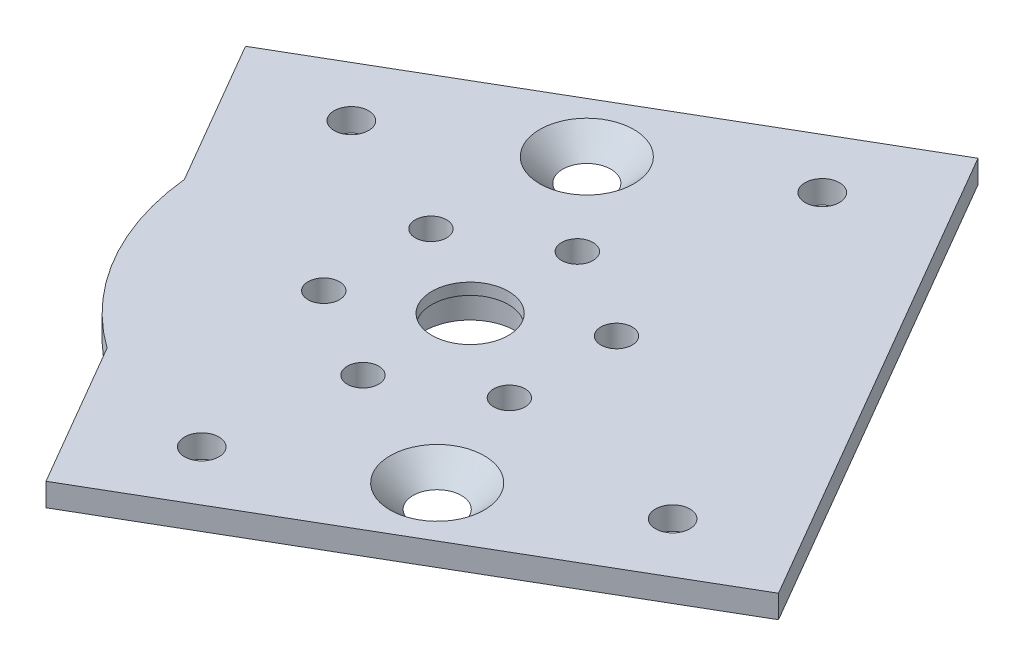
ISO-10303-21;
HEADER;
FILE_DESCRIPTION(('STEP AP214'),'2;1');
FILE_NAME('part.step','',(''),(''),'','','');
FILE_SCHEMA(('AUTOMOTIVE_DESIGN { 1 0 10303 214 1 1 1 1 }'));
ENDSEC;
DATA;
#1=APPLICATION_CONTEXT('core data for automotive mechanical design processes');
#2=APPLICATION_PROTOCOL_DEFINITION('international standard','automotive_design',2000,#1);
#3=PRODUCT_CONTEXT('',#1,'mechanical');
#4=PRODUCT('Part','Part','',(#3));
#5=PRODUCT_RELATED_PRODUCT_CATEGORY('part','',(#4));
#6=PRODUCT_DEFINITION_FORMATION('','',#4);
#7=PRODUCT_DEFINITION_CONTEXT('part definition',#1,'design');
#8=PRODUCT_DEFINITION('design','',#6,#7);
#9=PRODUCT_DEFINITION_SHAPE('','',#8);
#10=(LENGTH_UNIT() NAMED_UNIT(*) SI_UNIT(.MILLI.,.METRE.));
#11=(NAMED_UNIT(*) PLANE_ANGLE_UNIT() SI_UNIT($,.RADIAN.));
#12=(NAMED_UNIT(*) SI_UNIT($,.STERADIAN.) SOLID_ANGLE_UNIT());
#13=UNCERTAINTY_MEASURE_WITH_UNIT(LENGTH_MEASURE(1.E-05),#10,'distance_accuracy_value','');
#14=(GEOMETRIC_REPRESENTATION_CONTEXT(3) GLOBAL_UNCERTAINTY_ASSIGNED_CONTEXT((#13)) GLOBAL_UNIT_ASSIGNED_CONTEXT((#10,
#11,#12)) REPRESENTATION_CONTEXT('',''));
#15=CARTESIAN_POINT('',(0.,0.,0.));
#16=DIRECTION('',(0.,0.,1.));
#17=DIRECTION('',(1.,0.,0.));
#18=AXIS2_PLACEMENT_3D('',#15,#16,#17);
#19=CARTESIAN_POINT('',(0.,3.,0.));
#20=DIRECTION('',(0.,-1.,0.));
#21=DIRECTION('',(0.,0.,-1.));
#22=AXIS2_PLACEMENT_3D('',#19,#20,#21);
#23=CYLINDRICAL_SURFACE('',#22,34.);
#24=DIRECTION('',(0.,1.,0.));
#25=VECTOR('',#24,1.);
#26=CARTESIAN_POINT('',(-33.81860468845,0.,3.50741741547083));
#27=LINE('',#26,#25);
#28=CARTESIAN_POINT('',(-33.81860468845,0.,3.50741741547083));
#29=VERTEX_POINT('',#28);
#30=CARTESIAN_POINT('',(-33.81860468845,3.,3.50741741547083));
#31=VERTEX_POINT('',#30);
#32=EDGE_CURVE('E55',#29,#31,#27,.T.);
#33=ORIENTED_EDGE('',*,*,#32,.F.);
#34=CARTESIAN_POINT('',(0.,0.,0.));
#35=DIRECTION('',(0.,1.,0.));
#36=DIRECTION('',(0.,0.,1.));
#37=AXIS2_PLACEMENT_3D('',#34,#35,#36);
#38=CIRCLE('',#37,34.);
#39=CARTESIAN_POINT('',(-19.7823436250058,0.,27.6524660871719));
#40=VERTEX_POINT('',#39);
#41=EDGE_CURVE('E187',#29,#40,#38,.T.);
#42=ORIENTED_EDGE('',*,*,#41,.T.);
#43=DIRECTION('',(0.,1.,0.));
#44=VECTOR('',#43,1.);
#45=CARTESIAN_POINT('',(-19.7823436250058,0.,27.6524660871719));
#46=LINE('',#45,#44);
#47=CARTESIAN_POINT('',(-19.7823436250058,3.,27.6524660871719));
#48=VERTEX_POINT('',#47);
#49=EDGE_CURVE('E138',#40,#48,#46,.T.);
#50=ORIENTED_EDGE('',*,*,#49,.T.);
#51=CARTESIAN_POINT('',(0.,3.,0.));
#52=DIRECTION('',(0.,1.,0.));
#53=DIRECTION('',(0.,0.,1.));
#54=AXIS2_PLACEMENT_3D('',#51,#52,#53);
#55=CIRCLE('',#54,34.);
#56=EDGE_CURVE('E190',#31,#48,#55,.T.);
#57=ORIENTED_EDGE('',*,*,#56,.F.);
#58=EDGE_LOOP('',(#33,#42,#50,#57));
#59=FACE_BOUND('',#58,.T.);
#60=ADVANCED_FACE('F39',(#59),#23,.T.);
#61=CARTESIAN_POINT('',(0.,0.,0.));
#62=DIRECTION('',(0.,1.,0.));
#63=DIRECTION('',(0.,0.,1.));
#64=AXIS2_PLACEMENT_3D('',#61,#62,#63);
#65=PLANE('',#64);
#66=CARTESIAN_POINT('',(17.0277523842768,0.,21.3320333943987));
#67=DIRECTION('',(0.,1.,0.));
#68=DIRECTION('',(0.,0.,1.));
#69=AXIS2_PLACEMENT_3D('',#66,#67,#68);
#70=CIRCLE('',#69,3.15000000000008);
#71=CARTESIAN_POINT('',(17.0277523842768,0.,24.4820333943988));
#72=VERTEX_POINT('',#71);
#73=EDGE_CURVE('E11',#72,#72,#70,.T.);
#74=ORIENTED_EDGE('',*,*,#73,.T.);
#75=EDGE_LOOP('',(#74));
#76=FACE_BOUND('',#75,.T.);
#77=CARTESIAN_POINT('',(-10.1115009889926,0.,-25.3526635237722));
#78=DIRECTION('',(0.,1.,0.));
#79=DIRECTION('',(0.,0.,1.));
#80=AXIS2_PLACEMENT_3D('',#77,#78,#79);
#81=CIRCLE('',#80,3.15000000000003);
#82=CARTESIAN_POINT('',(-10.1115009889926,0.,-22.2026635237722));
#83=VERTEX_POINT('',#82);
#84=EDGE_CURVE('E48',#83,#83,#81,.T.);
#85=ORIENTED_EDGE('',*,*,#84,.T.);
#86=EDGE_LOOP('',(#85));
#87=FACE_BOUND('',#86,.T.);
#88=CARTESIAN_POINT('',(9.34045606024535,0.,-36.6606857626345));
#89=DIRECTION('',(0.,-1.,0.));
#90=DIRECTION('',(0.,0.,-1.));
#91=AXIS2_PLACEMENT_3D('',#88,#89,#90);
#92=CIRCLE('',#91,2.25);
#93=CARTESIAN_POINT('',(9.34045606024535,0.,-38.9106857626345));
#94=VERTEX_POINT('',#93);
#95=EDGE_CURVE('E539',#94,#94,#92,.T.);
#96=ORIENTED_EDGE('',*,*,#95,.F.);
#97=EDGE_LOOP('',(#96));
#98=FACE_BOUND('',#97,.T.);
#99=CARTESIAN_POINT('',(36.4797094335147,0.,10.0240111555365));
#100=DIRECTION('',(0.,-1.,0.));
#101=DIRECTION('',(0.,0.,-1.));
#102=AXIS2_PLACEMENT_3D('',#99,#100,#101);
#103=CIRCLE('',#102,2.25);
#104=CARTESIAN_POINT('',(36.4797094335147,0.,7.7740111555365));
#105=VERTEX_POINT('',#104);
#106=EDGE_CURVE('E535',#105,#105,#103,.T.);
#107=ORIENTED_EDGE('',*,*,#106,.F.);
#108=EDGE_LOOP('',(#107));
#109=FACE_BOUND('',#108,.T.);
#110=CARTESIAN_POINT('',(-29.5634580382305,0.,-14.04464128491));
#111=DIRECTION('',(0.,-1.,0.));
#112=DIRECTION('',(0.,0.,-1.));
#113=AXIS2_PLACEMENT_3D('',#110,#111,#112);
#114=CIRCLE('',#113,2.25);
#115=CARTESIAN_POINT('',(-29.5634580382305,0.,-16.29464128491));
#116=VERTEX_POINT('',#115);
#117=EDGE_CURVE('E531',#116,#116,#114,.T.);
#118=ORIENTED_EDGE('',*,*,#117,.F.);
#119=EDGE_LOOP('',(#118));
#120=FACE_BOUND('',#119,.T.);
#121=CARTESIAN_POINT('',(-2.42420466496118,0.,32.640055633261));
#122=DIRECTION('',(0.,-1.,0.));
#123=DIRECTION('',(0.,0.,-1.));
#124=AXIS2_PLACEMENT_3D('',#121,#122,#123);
#125=CIRCLE('',#124,2.25);
#126=CARTESIAN_POINT('',(-2.42420466496118,0.,30.390055633261));
#127=VERTEX_POINT('',#126);
#128=EDGE_CURVE('E540',#127,#127,#125,.T.);
#129=ORIENTED_EDGE('',*,*,#128,.F.);
#130=EDGE_LOOP('',(#129));
#131=FACE_BOUND('',#130,.T.);
#132=CARTESIAN_POINT('',(-12.1243556529822,0.,-6.99999999999905));
#133=DIRECTION('',(0.,1.,0.));
#134=DIRECTION('',(0.,0.,1.));
#135=AXIS2_PLACEMENT_3D('',#132,#133,#134);
#136=CIRCLE('',#135,2.05000000000121);
#137=CARTESIAN_POINT('',(-12.1243556529822,0.,-4.94999999999784));
#138=VERTEX_POINT('',#137);
#139=EDGE_CURVE('E157',#138,#138,#136,.T.);
#140=ORIENTED_EDGE('',*,*,#139,.T.);
#141=EDGE_LOOP('',(#140));
#142=FACE_BOUND('',#141,.T.);
#143=CARTESIAN_POINT('',(-12.1243556529807,0.,7.00000000000087));
#144=DIRECTION('',(0.,1.,0.));
#145=DIRECTION('',(0.,0.,1.));
#146=AXIS2_PLACEMENT_3D('',#143,#144,#145);
#147=CIRCLE('',#146,2.05000000000208);
#148=CARTESIAN_POINT('',(-12.1243556529807,0.,9.05000000000295));
#149=VERTEX_POINT('',#148);
#150=EDGE_CURVE('E156',#149,#149,#147,.T.);
#151=ORIENTED_EDGE('',*,*,#150,.T.);
#152=EDGE_LOOP('',(#151));
#153=FACE_BOUND('',#152,.T.);
#154=CARTESIAN_POINT('',(1.98437614357186E-12,0.,14.));
#155=DIRECTION('',(0.,1.,0.));
#156=DIRECTION('',(0.,0.,1.));
#157=AXIS2_PLACEMENT_3D('',#154,#155,#156);
#158=CIRCLE('',#157,2.05000000000225);
#159=CARTESIAN_POINT('',(1.98437614357186E-12,0.,16.0500000000022));
#160=VERTEX_POINT('',#159);
#161=EDGE_CURVE('E163',#160,#160,#158,.T.);
#162=ORIENTED_EDGE('',*,*,#161,.T.);
#163=EDGE_LOOP('',(#162));
#164=FACE_BOUND('',#163,.T.);
#165=CARTESIAN_POINT('',(12.1243556529836,0.,6.99999999999914));
#166=DIRECTION('',(0.,1.,0.));
#167=DIRECTION('',(0.,0.,1.));
#168=AXIS2_PLACEMENT_3D('',#165,#166,#167);
#169=CIRCLE('',#168,2.05000000000147);
#170=CARTESIAN_POINT('',(12.1243556529836,0.,9.05000000000061));
#171=VERTEX_POINT('',#170);
#172=EDGE_CURVE('E169',#171,#171,#169,.T.);
#173=ORIENTED_EDGE('',*,*,#172,.T.);
#174=EDGE_LOOP('',(#173));
#175=FACE_BOUND('',#174,.T.);
#176=CARTESIAN_POINT('',(12.1243556529826,0.,-7.00000000000086));
#177=DIRECTION('',(0.,1.,0.));
#178=DIRECTION('',(0.,0.,1.));
#179=AXIS2_PLACEMENT_3D('',#176,#177,#178);
#180=CIRCLE('',#179,2.05000000000028);
#181=CARTESIAN_POINT('',(12.1243556529826,0.,-4.95000000000058));
#182=VERTEX_POINT('',#181);
#183=EDGE_CURVE('E175',#182,#182,#180,.T.);
#184=ORIENTED_EDGE('',*,*,#183,.T.);
#185=EDGE_LOOP('',(#184));
#186=FACE_BOUND('',#185,.T.);
#187=CARTESIAN_POINT('',(0.,0.,-14.));
#188=DIRECTION('',(0.,1.,0.));
#189=DIRECTION('',(0.,0.,1.));
#190=AXIS2_PLACEMENT_3D('',#187,#188,#189);
#191=CIRCLE('',#190,2.05);
#192=CARTESIAN_POINT('',(0.,0.,-11.95));
#193=VERTEX_POINT('',#192);
#194=EDGE_CURVE('E181',#193,#193,#191,.T.);
#195=ORIENTED_EDGE('',*,*,#194,.T.);
#196=EDGE_LOOP('',(#195));
#197=FACE_BOUND('',#196,.T.);
#198=ORIENTED_EDGE('',*,*,#41,.F.);
#199=DIRECTION('',(-0.502578766171655,0.,-0.864531424410575));
#200=VECTOR('',#199,1.);
#201=CARTESIAN_POINT('',(-26.8004741567279,0.,15.5799417513214));
#202=LINE('',#201,#200);
#203=CARTESIAN_POINT('',(-44.8933097389076,0.,-15.5431895274595));
#204=VERTEX_POINT('',#203);
#205=EDGE_CURVE('E61',#29,#204,#202,.T.);
#206=ORIENTED_EDGE('',*,*,#205,.T.);
#207=DIRECTION('',(-0.864531424410575,0.,0.502578766171655));
#208=VECTOR('',#207,1.);
#209=CARTESIAN_POINT('',(-18.0928355821797,0.,-31.1231312787809));
#210=LINE('',#209,#208);
#211=CARTESIAN_POINT('',(15.6238899698326,0.,-50.7237031594753));
#212=VERTEX_POINT('',#211);
#213=EDGE_CURVE('E101',#212,#204,#210,.T.);
#214=ORIENTED_EDGE('',*,*,#213,.F.);
#215=DIRECTION('',(-0.502578766171655,0.,-0.864531424410575));
#216=VECTOR('',#215,1.);
#217=CARTESIAN_POINT('',(33.7167255520123,0.,-19.6005718806945));
#218=LINE('',#217,#216);
#219=CARTESIAN_POINT('',(51.8095611341918,0.,11.522559398086));
#220=VERTEX_POINT('',#219);
#221=EDGE_CURVE('E113',#220,#212,#218,.T.);
#222=ORIENTED_EDGE('',*,*,#221,.F.);
#223=DIRECTION('',(-0.864531424410575,0.,0.502578766171655));
#224=VECTOR('',#223,1.);
#225=CARTESIAN_POINT('',(18.0928355821794,0.,31.1231312787805));
#226=LINE('',#225,#224);
#227=CARTESIAN_POINT('',(-8.70763857454847,0.,46.7030730301018));
#228=VERTEX_POINT('',#227);
#229=EDGE_CURVE('E117',#220,#228,#226,.T.);
#230=ORIENTED_EDGE('',*,*,#229,.T.);
#231=EDGE_CURVE('E91',#228,#40,#202,.T.);
#232=ORIENTED_EDGE('',*,*,#231,.T.);
#233=EDGE_LOOP('',(#198,#206,#214,#222,#230,#232));
#234=FACE_BOUND('',#233,.T.);
#235=CARTESIAN_POINT('',(0.,0.,0.));
#236=DIRECTION('',(0.,1.,0.));
#237=DIRECTION('',(0.,0.,1.));
#238=AXIS2_PLACEMENT_3D('',#235,#236,#237);
#239=CIRCLE('',#238,7.);
#240=CARTESIAN_POINT('',(0.,0.,7.));
#241=VERTEX_POINT('',#240);
#242=EDGE_CURVE('E193',#241,#241,#239,.F.);
#243=ORIENTED_EDGE('',*,*,#242,.F.);
#244=EDGE_LOOP('',(#243));
#245=FACE_BOUND('',#244,.T.);
#246=ADVANCED_FACE('F111',(#76,#87,#98,#109,#120,#131,#142,#153,#164,#175,#186,#197,#234,#245),
#65,.F.);
#247=CARTESIAN_POINT('',(0.,3.,0.));
#248=DIRECTION('',(0.,-1.,0.));
#249=DIRECTION('',(0.,0.,-1.));
#250=AXIS2_PLACEMENT_3D('',#247,#248,#249);
#251=CYLINDRICAL_SURFACE('',#250,6.);
#252=CARTESIAN_POINT('',(0.,1.5,0.));
#253=DIRECTION('',(0.,1.,0.));
#254=DIRECTION('',(0.,0.,1.));
#255=AXIS2_PLACEMENT_3D('',#252,#253,#254);
#256=CIRCLE('',#255,6.);
#257=CARTESIAN_POINT('',(0.,1.5,6.));
#258=VERTEX_POINT('',#257);
#259=EDGE_CURVE('E150',#258,#258,#256,.T.);
#260=ORIENTED_EDGE('',*,*,#259,.T.);
#261=EDGE_LOOP('',(#260));
#262=FACE_BOUND('',#261,.T.);
#263=CARTESIAN_POINT('',(0.,-2.,0.));
#264=DIRECTION('',(0.,-1.,0.));
#265=DIRECTION('',(0.,0.,-1.));
#266=AXIS2_PLACEMENT_3D('',#263,#264,#265);
#267=CIRCLE('',#266,6.);
#268=CARTESIAN_POINT('',(0.,-2.,-6.));
#269=VERTEX_POINT('',#268);
#270=EDGE_CURVE('E132',#269,#269,#267,.T.);
#271=ORIENTED_EDGE('',*,*,#270,.T.);
#272=EDGE_LOOP('',(#271));
#273=FACE_BOUND('',#272,.T.);
#274=ADVANCED_FACE('F219',(#262,#273),#251,.F.);
#275=CARTESIAN_POINT('',(0.,3.,0.));
#276=DIRECTION('',(0.,1.,0.));
#277=DIRECTION('',(0.,0.,1.));
#278=AXIS2_PLACEMENT_3D('',#275,#276,#277);
#279=PLANE('',#278);
#280=CARTESIAN_POINT('',(17.0277523842768,3.,21.3320333943987));
#281=DIRECTION('',(0.,1.,0.));
#282=DIRECTION('',(0.,0.,1.));
#283=AXIS2_PLACEMENT_3D('',#280,#281,#282);
#284=CIRCLE('',#283,6.15000000000011);
#285=CARTESIAN_POINT('',(17.0277523842768,3.,27.4820333943988));
#286=VERTEX_POINT('',#285);
#287=EDGE_CURVE('E203',#286,#286,#284,.F.);
#288=ORIENTED_EDGE('',*,*,#287,.T.);
#289=EDGE_LOOP('',(#288));
#290=FACE_BOUND('',#289,.T.);
#291=CARTESIAN_POINT('',(-10.1115009889926,3.,-25.3526635237722));
#292=DIRECTION('',(0.,1.,0.));
#293=DIRECTION('',(0.,0.,1.));
#294=AXIS2_PLACEMENT_3D('',#291,#292,#293);
#295=CIRCLE('',#294,6.15000000000006);
#296=CARTESIAN_POINT('',(-10.1115009889926,3.,-19.2026635237722));
#297=VERTEX_POINT('',#296);
#298=EDGE_CURVE('E200',#297,#297,#295,.F.);
#299=ORIENTED_EDGE('',*,*,#298,.T.);
#300=EDGE_LOOP('',(#299));
#301=FACE_BOUND('',#300,.T.);
#302=CARTESIAN_POINT('',(9.34045606024535,3.,-36.6606857626345));
#303=DIRECTION('',(0.,-1.,0.));
#304=DIRECTION('',(0.,0.,-1.));
#305=AXIS2_PLACEMENT_3D('',#302,#303,#304);
#306=CIRCLE('',#305,2.25);
#307=CARTESIAN_POINT('',(9.34045606024535,3.,-38.9106857626345));
#308=VERTEX_POINT('',#307);
#309=EDGE_CURVE('E125',#308,#308,#306,.T.);
#310=ORIENTED_EDGE('',*,*,#309,.T.);
#311=EDGE_LOOP('',(#310));
#312=FACE_BOUND('',#311,.T.);
#313=CARTESIAN_POINT('',(36.4797094335147,3.,10.0240111555365));
#314=DIRECTION('',(0.,-1.,0.));
#315=DIRECTION('',(0.,0.,-1.));
#316=AXIS2_PLACEMENT_3D('',#313,#314,#315);
#317=CIRCLE('',#316,2.25);
#318=CARTESIAN_POINT('',(36.4797094335147,3.,7.7740111555365));
#319=VERTEX_POINT('',#318);
#320=EDGE_CURVE('E228',#319,#319,#317,.T.);
#321=ORIENTED_EDGE('',*,*,#320,.T.);
#322=EDGE_LOOP('',(#321));
#323=FACE_BOUND('',#322,.T.);
#324=CARTESIAN_POINT('',(-29.5634580382305,3.,-14.04464128491));
#325=DIRECTION('',(0.,-1.,0.));
#326=DIRECTION('',(0.,0.,-1.));
#327=AXIS2_PLACEMENT_3D('',#324,#325,#326);
#328=CIRCLE('',#327,2.25);
#329=CARTESIAN_POINT('',(-29.5634580382305,3.,-16.29464128491));
#330=VERTEX_POINT('',#329);
#331=EDGE_CURVE('E232',#330,#330,#328,.T.);
#332=ORIENTED_EDGE('',*,*,#331,.T.);
#333=EDGE_LOOP('',(#332));
#334=FACE_BOUND('',#333,.T.);
#335=CARTESIAN_POINT('',(-2.42420466496118,3.,32.640055633261));
#336=DIRECTION('',(0.,-1.,0.));
#337=DIRECTION('',(0.,0.,-1.));
#338=AXIS2_PLACEMENT_3D('',#335,#336,#337);
#339=CIRCLE('',#338,2.25);
#340=CARTESIAN_POINT('',(-2.42420466496118,3.,30.390055633261));
#341=VERTEX_POINT('',#340);
#342=EDGE_CURVE('E236',#341,#341,#339,.T.);
#343=ORIENTED_EDGE('',*,*,#342,.T.);
#344=EDGE_LOOP('',(#343));
#345=FACE_BOUND('',#344,.T.);
#346=CARTESIAN_POINT('',(-12.1243556529807,3.,7.00000000000087));
#347=DIRECTION('',(0.,1.,0.));
#348=DIRECTION('',(0.,0.,1.));
#349=AXIS2_PLACEMENT_3D('',#346,#347,#348);
#350=CIRCLE('',#349,2.05000000000208);
#351=CARTESIAN_POINT('',(-12.1243556529807,3.,9.05000000000295));
#352=VERTEX_POINT('',#351);
#353=EDGE_CURVE('E160',#352,#352,#350,.T.);
#354=ORIENTED_EDGE('',*,*,#353,.F.);
#355=EDGE_LOOP('',(#354));
#356=FACE_BOUND('',#355,.T.);
#357=CARTESIAN_POINT('',(12.1243556529836,3.,6.99999999999914));
#358=DIRECTION('',(0.,1.,0.));
#359=DIRECTION('',(0.,0.,1.));
#360=AXIS2_PLACEMENT_3D('',#357,#358,#359);
#361=CIRCLE('',#360,2.05000000000147);
#362=CARTESIAN_POINT('',(12.1243556529836,3.,9.05000000000061));
#363=VERTEX_POINT('',#362);
#364=EDGE_CURVE('E172',#363,#363,#361,.T.);
#365=ORIENTED_EDGE('',*,*,#364,.F.);
#366=EDGE_LOOP('',(#365));
#367=FACE_BOUND('',#366,.T.);
#368=ORIENTED_EDGE('',*,*,#56,.T.);
#369=DIRECTION('',(-0.502578766171655,0.,-0.864531424410575));
#370=VECTOR('',#369,1.);
#371=CARTESIAN_POINT('',(-26.8004741567279,3.,15.5799417513214));
#372=LINE('',#371,#370);
#373=CARTESIAN_POINT('',(-8.70763857454847,3.,46.7030730301018));
#374=VERTEX_POINT('',#373);
#375=EDGE_CURVE('E122',#374,#48,#372,.T.);
#376=ORIENTED_EDGE('',*,*,#375,.F.);
#377=DIRECTION('',(-0.864531424410575,0.,0.502578766171655));
#378=VECTOR('',#377,1.);
#379=CARTESIAN_POINT('',(18.0928355821794,3.,31.1231312787805));
#380=LINE('',#379,#378);
#381=CARTESIAN_POINT('',(51.8095611341918,3.,11.522559398086));
#382=VERTEX_POINT('',#381);
#383=EDGE_CURVE('E124',#382,#374,#380,.T.);
#384=ORIENTED_EDGE('',*,*,#383,.F.);
#385=DIRECTION('',(-0.502578766171655,0.,-0.864531424410575));
#386=VECTOR('',#385,1.);
#387=CARTESIAN_POINT('',(33.7167255520123,3.,-19.6005718806945));
#388=LINE('',#387,#386);
#389=CARTESIAN_POINT('',(15.6238899698326,3.,-50.7237031594753));
#390=VERTEX_POINT('',#389);
#391=EDGE_CURVE('E128',#382,#390,#388,.T.);
#392=ORIENTED_EDGE('',*,*,#391,.T.);
#393=DIRECTION('',(-0.864531424410575,0.,0.502578766171655));
#394=VECTOR('',#393,1.);
#395=CARTESIAN_POINT('',(-18.0928355821797,3.,-31.1231312787809));
#396=LINE('',#395,#394);
#397=CARTESIAN_POINT('',(-44.8933097389076,3.,-15.5431895274595));
#398=VERTEX_POINT('',#397);
#399=EDGE_CURVE('E103',#390,#398,#396,.T.);
#400=ORIENTED_EDGE('',*,*,#399,.T.);
#401=EDGE_CURVE('E126',#31,#398,#372,.T.);
#402=ORIENTED_EDGE('',*,*,#401,.F.);
#403=EDGE_LOOP('',(#368,#376,#384,#392,#400,#402));
#404=FACE_BOUND('',#403,.T.);
#405=CARTESIAN_POINT('',(0.,3.,-14.));
#406=DIRECTION('',(0.,1.,0.));
#407=DIRECTION('',(0.,0.,1.));
#408=AXIS2_PLACEMENT_3D('',#405,#406,#407);
#409=CIRCLE('',#408,2.05);
#410=CARTESIAN_POINT('',(0.,3.,-11.95));
#411=VERTEX_POINT('',#410);
#412=EDGE_CURVE('E184',#411,#411,#409,.T.);
#413=ORIENTED_EDGE('',*,*,#412,.F.);
#414=EDGE_LOOP('',(#413));
#415=FACE_BOUND('',#414,.T.);
#416=CARTESIAN_POINT('',(12.1243556529826,3.,-7.00000000000086));
#417=DIRECTION('',(0.,1.,0.));
#418=DIRECTION('',(0.,0.,1.));
#419=AXIS2_PLACEMENT_3D('',#416,#417,#418);
#420=CIRCLE('',#419,2.05000000000028);
#421=CARTESIAN_POINT('',(12.1243556529826,3.,-4.95000000000058));
#422=VERTEX_POINT('',#421);
#423=EDGE_CURVE('E178',#422,#422,#420,.T.);
#424=ORIENTED_EDGE('',*,*,#423,.F.);
#425=EDGE_LOOP('',(#424));
#426=FACE_BOUND('',#425,.T.);
#427=CARTESIAN_POINT('',(1.98437614357186E-12,3.,14.));
#428=DIRECTION('',(0.,1.,0.));
#429=DIRECTION('',(0.,0.,1.));
#430=AXIS2_PLACEMENT_3D('',#427,#428,#429);
#431=CIRCLE('',#430,2.05000000000225);
#432=CARTESIAN_POINT('',(1.98437614357186E-12,3.,16.0500000000022));
#433=VERTEX_POINT('',#432);
#434=EDGE_CURVE('E166',#433,#433,#431,.T.);
#435=ORIENTED_EDGE('',*,*,#434,.F.);
#436=EDGE_LOOP('',(#435));
#437=FACE_BOUND('',#436,.T.);
#438=CARTESIAN_POINT('',(-12.1243556529822,3.,-6.99999999999905));
#439=DIRECTION('',(0.,1.,0.));
#440=DIRECTION('',(0.,0.,1.));
#441=AXIS2_PLACEMENT_3D('',#438,#439,#440);
#442=CIRCLE('',#441,2.05000000000121);
#443=CARTESIAN_POINT('',(-12.1243556529822,3.,-4.94999999999784));
#444=VERTEX_POINT('',#443);
#445=EDGE_CURVE('E153',#444,#444,#442,.T.);
#446=ORIENTED_EDGE('',*,*,#445,.F.);
#447=EDGE_LOOP('',(#446));
#448=FACE_BOUND('',#447,.T.);
#449=CARTESIAN_POINT('',(0.,3.,0.));
#450=DIRECTION('',(0.,1.,0.));
#451=DIRECTION('',(0.,0.,1.));
#452=AXIS2_PLACEMENT_3D('',#449,#450,#451);
#453=CIRCLE('',#452,5.);
#454=CARTESIAN_POINT('',(0.,3.,5.));
#455=VERTEX_POINT('',#454);
#456=EDGE_CURVE('E146',#455,#455,#453,.T.);
#457=ORIENTED_EDGE('',*,*,#456,.F.);
#458=EDGE_LOOP('',(#457));
#459=FACE_BOUND('',#458,.T.);
#460=ADVANCED_FACE('F215',(#290,#301,#312,#323,#334,#345,#356,#367,#404,#415,#426,#437,#448,
#459),#279,.T.);
#461=CARTESIAN_POINT('',(0.,3.,-14.));
#462=DIRECTION('',(0.,-1.,0.));
#463=DIRECTION('',(0.,0.,-1.));
#464=AXIS2_PLACEMENT_3D('',#461,#462,#463);
#465=CYLINDRICAL_SURFACE('',#464,2.05);
#466=ORIENTED_EDGE('',*,*,#412,.T.);
#467=EDGE_LOOP('',(#466));
#468=FACE_BOUND('',#467,.T.);
#469=ORIENTED_EDGE('',*,*,#194,.F.);
#470=EDGE_LOOP('',(#469));
#471=FACE_BOUND('',#470,.T.);
#472=ADVANCED_FACE('F218',(#468,#471),#465,.F.);
#473=CARTESIAN_POINT('',(12.1243556529826,3.,-7.00000000000086));
#474=DIRECTION('',(0.,-1.,0.));
#475=DIRECTION('',(0.,0.,-1.));
#476=AXIS2_PLACEMENT_3D('',#473,#474,#475);
#477=CYLINDRICAL_SURFACE('',#476,2.05000000000028);
#478=ORIENTED_EDGE('',*,*,#423,.T.);
#479=EDGE_LOOP('',(#478));
#480=FACE_BOUND('',#479,.T.);
#481=ORIENTED_EDGE('',*,*,#183,.F.);
#482=EDGE_LOOP('',(#481));
#483=FACE_BOUND('',#482,.T.);
#484=ADVANCED_FACE('F338',(#480,#483),#477,.F.);
#485=CARTESIAN_POINT('',(12.1243556529836,3.,6.99999999999914));
#486=DIRECTION('',(0.,-1.,0.));
#487=DIRECTION('',(0.,0.,-1.));
#488=AXIS2_PLACEMENT_3D('',#485,#486,#487);
#489=CYLINDRICAL_SURFACE('',#488,2.05000000000147);
#490=ORIENTED_EDGE('',*,*,#364,.T.);
#491=EDGE_LOOP('',(#490));
#492=FACE_BOUND('',#491,.T.);
#493=ORIENTED_EDGE('',*,*,#172,.F.);
#494=EDGE_LOOP('',(#493));
#495=FACE_BOUND('',#494,.T.);
#496=ADVANCED_FACE('F345',(#492,#495),#489,.F.);
#497=CARTESIAN_POINT('',(1.98437614357186E-12,3.,14.));
#498=DIRECTION('',(0.,-1.,0.));
#499=DIRECTION('',(0.,0.,-1.));
#500=AXIS2_PLACEMENT_3D('',#497,#498,#499);
#501=CYLINDRICAL_SURFACE('',#500,2.05000000000225);
#502=ORIENTED_EDGE('',*,*,#434,.T.);
#503=EDGE_LOOP('',(#502));
#504=FACE_BOUND('',#503,.T.);
#505=ORIENTED_EDGE('',*,*,#161,.F.);
#506=EDGE_LOOP('',(#505));
#507=FACE_BOUND('',#506,.T.);
#508=ADVANCED_FACE('F353',(#504,#507),#501,.F.);
#509=CARTESIAN_POINT('',(-12.1243556529807,3.,7.00000000000087));
#510=DIRECTION('',(0.,-1.,0.));
#511=DIRECTION('',(0.,0.,-1.));
#512=AXIS2_PLACEMENT_3D('',#509,#510,#511);
#513=CYLINDRICAL_SURFACE('',#512,2.05000000000208);
#514=ORIENTED_EDGE('',*,*,#353,.T.);
#515=EDGE_LOOP('',(#514));
#516=FACE_BOUND('',#515,.T.);
#517=ORIENTED_EDGE('',*,*,#150,.F.);
#518=EDGE_LOOP('',(#517));
#519=FACE_BOUND('',#518,.T.);
#520=ADVANCED_FACE('F361',(#516,#519),#513,.F.);
#521=CARTESIAN_POINT('',(-12.1243556529822,3.,-6.99999999999905));
#522=DIRECTION('',(0.,-1.,0.));
#523=DIRECTION('',(0.,0.,-1.));
#524=AXIS2_PLACEMENT_3D('',#521,#522,#523);
#525=CYLINDRICAL_SURFACE('',#524,2.05000000000121);
#526=ORIENTED_EDGE('',*,*,#445,.T.);
#527=EDGE_LOOP('',(#526));
#528=FACE_BOUND('',#527,.T.);
#529=ORIENTED_EDGE('',*,*,#139,.F.);
#530=EDGE_LOOP('',(#529));
#531=FACE_BOUND('',#530,.T.);
#532=ADVANCED_FACE('F267',(#528,#531),#525,.F.);
#533=CARTESIAN_POINT('',(0.,1.5,0.));
#534=DIRECTION('',(0.,1.,0.));
#535=DIRECTION('',(0.,0.,1.));
#536=AXIS2_PLACEMENT_3D('',#533,#534,#535);
#537=PLANE('',#536);
#538=CARTESIAN_POINT('',(0.,1.5,0.));
#539=DIRECTION('',(0.,1.,0.));
#540=DIRECTION('',(0.,0.,1.));
#541=AXIS2_PLACEMENT_3D('',#538,#539,#540);
#542=CIRCLE('',#541,5.);
#543=CARTESIAN_POINT('',(0.,1.5,5.));
#544=VERTEX_POINT('',#543);
#545=EDGE_CURVE('E147',#544,#544,#542,.T.);
#546=ORIENTED_EDGE('',*,*,#545,.T.);
#547=EDGE_LOOP('',(#546));
#548=FACE_BOUND('',#547,.T.);
#549=ORIENTED_EDGE('',*,*,#259,.F.);
#550=EDGE_LOOP('',(#549));
#551=FACE_BOUND('',#550,.T.);
#552=ADVANCED_FACE('F257',(#548,#551),#537,.F.);
#553=CARTESIAN_POINT('',(0.,1.5,0.));
#554=DIRECTION('',(0.,1.,0.));
#555=DIRECTION('',(0.,0.,1.));
#556=AXIS2_PLACEMENT_3D('',#553,#554,#555);
#557=CYLINDRICAL_SURFACE('',#556,5.);
#558=ORIENTED_EDGE('',*,*,#545,.F.);
#559=EDGE_LOOP('',(#558));
#560=FACE_BOUND('',#559,.T.);
#561=ORIENTED_EDGE('',*,*,#456,.T.);
#562=EDGE_LOOP('',(#561));
#563=FACE_BOUND('',#562,.T.);
#564=ADVANCED_FACE('F254',(#560,#563),#557,.F.);
#565=CARTESIAN_POINT('',(0.,-2.,0.));
#566=DIRECTION('',(0.,-1.,0.));
#567=DIRECTION('',(0.,0.,-1.));
#568=AXIS2_PLACEMENT_3D('',#565,#566,#567);
#569=PLANE('',#568);
#570=CARTESIAN_POINT('',(0.,-2.,0.));
#571=DIRECTION('',(0.,-1.,0.));
#572=DIRECTION('',(0.,0.,-1.));
#573=AXIS2_PLACEMENT_3D('',#570,#571,#572);
#574=CIRCLE('',#573,7.);
#575=CARTESIAN_POINT('',(0.,-2.,-7.));
#576=VERTEX_POINT('',#575);
#577=EDGE_CURVE('E143',#576,#576,#574,.T.);
#578=ORIENTED_EDGE('',*,*,#577,.T.);
#579=EDGE_LOOP('',(#578));
#580=FACE_BOUND('',#579,.T.);
#581=ORIENTED_EDGE('',*,*,#270,.F.);
#582=EDGE_LOOP('',(#581));
#583=FACE_BOUND('',#582,.T.);
#584=ADVANCED_FACE('F256',(#580,#583),#569,.T.);
#585=CARTESIAN_POINT('',(0.,-2.,0.));
#586=DIRECTION('',(0.,1.,0.));
#587=DIRECTION('',(0.,0.,1.));
#588=AXIS2_PLACEMENT_3D('',#585,#586,#587);
#589=CYLINDRICAL_SURFACE('',#588,7.);
#590=ORIENTED_EDGE('',*,*,#577,.F.);
#591=EDGE_LOOP('',(#590));
#592=FACE_BOUND('',#591,.T.);
#593=ORIENTED_EDGE('',*,*,#242,.T.);
#594=EDGE_LOOP('',(#593));
#595=FACE_BOUND('',#594,.T.);
#596=ADVANCED_FACE('F264',(#592,#595),#589,.T.);
#597=CARTESIAN_POINT('',(-26.8004741567279,0.,15.5799417513214));
#598=DIRECTION('',(0.864531424410575,0.,-0.502578766171655));
#599=DIRECTION('',(-0.502578766171655,0.,-0.864531424410575));
#600=AXIS2_PLACEMENT_3D('',#597,#598,#599);
#601=PLANE('',#600);
#602=ORIENTED_EDGE('',*,*,#401,.T.);
#603=DIRECTION('',(0.,1.,0.));
#604=VECTOR('',#603,1.);
#605=CARTESIAN_POINT('',(-44.8933097389076,0.,-15.5431895274595));
#606=LINE('',#605,#604);
#607=EDGE_CURVE('E83',#204,#398,#606,.T.);
#608=ORIENTED_EDGE('',*,*,#607,.F.);
#609=ORIENTED_EDGE('',*,*,#205,.F.);
#610=ORIENTED_EDGE('',*,*,#32,.T.);
#611=EDGE_LOOP('',(#602,#608,#609,#610));
#612=FACE_BOUND('',#611,.T.);
#613=ADVANCED_FACE('F311',(#612),#601,.F.);
#614=CARTESIAN_POINT('',(-18.0928355821797,0.,-31.1231312787809));
#615=DIRECTION('',(-0.502578766171655,0.,-0.864531424410575));
#616=DIRECTION('',(-0.864531424410575,0.,0.502578766171655));
#617=AXIS2_PLACEMENT_3D('',#614,#615,#616);
#618=PLANE('',#617);
#619=ORIENTED_EDGE('',*,*,#399,.F.);
#620=DIRECTION('',(0.,1.,0.));
#621=VECTOR('',#620,1.);
#622=CARTESIAN_POINT('',(15.6238899698326,0.,-50.7237031594753));
#623=LINE('',#622,#621);
#624=EDGE_CURVE('E98',#212,#390,#623,.T.);
#625=ORIENTED_EDGE('',*,*,#624,.F.);
#626=ORIENTED_EDGE('',*,*,#213,.T.);
#627=ORIENTED_EDGE('',*,*,#607,.T.);
#628=EDGE_LOOP('',(#619,#625,#626,#627));
#629=FACE_BOUND('',#628,.T.);
#630=ADVANCED_FACE('F100',(#629),#618,.T.);
#631=CARTESIAN_POINT('',(33.7167255520123,0.,-19.6005718806945));
#632=DIRECTION('',(0.864531424410575,0.,-0.502578766171655));
#633=DIRECTION('',(-0.502578766171655,0.,-0.864531424410575));
#634=AXIS2_PLACEMENT_3D('',#631,#632,#633);
#635=PLANE('',#634);
#636=ORIENTED_EDGE('',*,*,#391,.F.);
#637=DIRECTION('',(0.,1.,0.));
#638=VECTOR('',#637,1.);
#639=CARTESIAN_POINT('',(51.8095611341918,0.,11.522559398086));
#640=LINE('',#639,#638);
#641=EDGE_CURVE('E108',#220,#382,#640,.T.);
#642=ORIENTED_EDGE('',*,*,#641,.F.);
#643=ORIENTED_EDGE('',*,*,#221,.T.);
#644=ORIENTED_EDGE('',*,*,#624,.T.);
#645=EDGE_LOOP('',(#636,#642,#643,#644));
#646=FACE_BOUND('',#645,.T.);
#647=ADVANCED_FACE('F115',(#646),#635,.T.);
#648=CARTESIAN_POINT('',(18.0928355821794,0.,31.1231312787805));
#649=DIRECTION('',(-0.502578766171655,0.,-0.864531424410575));
#650=DIRECTION('',(-0.864531424410575,0.,0.502578766171655));
#651=AXIS2_PLACEMENT_3D('',#648,#649,#650);
#652=PLANE('',#651);
#653=ORIENTED_EDGE('',*,*,#383,.T.);
#654=DIRECTION('',(0.,1.,0.));
#655=VECTOR('',#654,1.);
#656=CARTESIAN_POINT('',(-8.70763857454847,0.,46.7030730301018));
#657=LINE('',#656,#655);
#658=EDGE_CURVE('E135',#228,#374,#657,.T.);
#659=ORIENTED_EDGE('',*,*,#658,.F.);
#660=ORIENTED_EDGE('',*,*,#229,.F.);
#661=ORIENTED_EDGE('',*,*,#641,.T.);
#662=EDGE_LOOP('',(#653,#659,#660,#661));
#663=FACE_BOUND('',#662,.T.);
#664=ADVANCED_FACE('F318',(#663),#652,.F.);
#665=ORIENTED_EDGE('',*,*,#375,.T.);
#666=ORIENTED_EDGE('',*,*,#49,.F.);
#667=ORIENTED_EDGE('',*,*,#231,.F.);
#668=ORIENTED_EDGE('',*,*,#658,.T.);
#669=EDGE_LOOP('',(#665,#666,#667,#668));
#670=FACE_BOUND('',#669,.T.);
#671=ADVANCED_FACE('F305',(#670),#601,.F.);
#672=CARTESIAN_POINT('',(-2.42420466496118,3.,32.640055633261));
#673=DIRECTION('',(0.,-1.,0.));
#674=DIRECTION('',(0.,0.,-1.));
#675=AXIS2_PLACEMENT_3D('',#672,#673,#674);
#676=CYLINDRICAL_SURFACE('',#675,2.25);
#677=ORIENTED_EDGE('',*,*,#342,.F.);
#678=EDGE_LOOP('',(#677));
#679=FACE_BOUND('',#678,.T.);
#680=ORIENTED_EDGE('',*,*,#128,.T.);
#681=EDGE_LOOP('',(#680));
#682=FACE_BOUND('',#681,.T.);
#683=ADVANCED_FACE('F303',(#679,#682),#676,.F.);
#684=CARTESIAN_POINT('',(-29.5634580382305,3.,-14.04464128491));
#685=DIRECTION('',(0.,-1.,0.));
#686=DIRECTION('',(0.,0.,-1.));
#687=AXIS2_PLACEMENT_3D('',#684,#685,#686);
#688=CYLINDRICAL_SURFACE('',#687,2.25);
#689=ORIENTED_EDGE('',*,*,#331,.F.);
#690=EDGE_LOOP('',(#689));
#691=FACE_BOUND('',#690,.T.);
#692=ORIENTED_EDGE('',*,*,#117,.T.);
#693=EDGE_LOOP('',(#692));
#694=FACE_BOUND('',#693,.T.);
#695=ADVANCED_FACE('F298',(#691,#694),#688,.F.);
#696=CARTESIAN_POINT('',(36.4797094335147,3.,10.0240111555365));
#697=DIRECTION('',(0.,-1.,0.));
#698=DIRECTION('',(0.,0.,-1.));
#699=AXIS2_PLACEMENT_3D('',#696,#697,#698);
#700=CYLINDRICAL_SURFACE('',#699,2.25);
#701=ORIENTED_EDGE('',*,*,#320,.F.);
#702=EDGE_LOOP('',(#701));
#703=FACE_BOUND('',#702,.T.);
#704=ORIENTED_EDGE('',*,*,#106,.T.);
#705=EDGE_LOOP('',(#704));
#706=FACE_BOUND('',#705,.T.);
#707=ADVANCED_FACE('F289',(#703,#706),#700,.F.);
#708=CARTESIAN_POINT('',(9.34045606024535,3.,-36.6606857626345));
#709=DIRECTION('',(0.,-1.,0.));
#710=DIRECTION('',(0.,0.,-1.));
#711=AXIS2_PLACEMENT_3D('',#708,#709,#710);
#712=CYLINDRICAL_SURFACE('',#711,2.25);
#713=ORIENTED_EDGE('',*,*,#309,.F.);
#714=EDGE_LOOP('',(#713));
#715=FACE_BOUND('',#714,.T.);
#716=ORIENTED_EDGE('',*,*,#95,.T.);
#717=EDGE_LOOP('',(#716));
#718=FACE_BOUND('',#717,.T.);
#719=ADVANCED_FACE('F284',(#715,#718),#712,.F.);
#720=CARTESIAN_POINT('',(17.0277523842768,3.,21.3320333943987));
#721=DIRECTION('',(0.,1.,0.));
#722=DIRECTION('',(0.,0.,1.));
#723=AXIS2_PLACEMENT_3D('',#720,#721,#722);
#724=CONICAL_SURFACE('',#723,6.15000000000011,0.785398163397453);
#725=ORIENTED_EDGE('',*,*,#73,.F.);
#726=EDGE_LOOP('',(#725));
#727=FACE_BOUND('',#726,.T.);
#728=ORIENTED_EDGE('',*,*,#287,.F.);
#729=EDGE_LOOP('',(#728));
#730=FACE_BOUND('',#729,.T.);
#731=ADVANCED_FACE('F212',(#727,#730),#724,.F.);
#732=CARTESIAN_POINT('',(-10.1115009889926,3.,-25.3526635237722));
#733=DIRECTION('',(0.,1.,0.));
#734=DIRECTION('',(0.,0.,1.));
#735=AXIS2_PLACEMENT_3D('',#732,#733,#734);
#736=CONICAL_SURFACE('',#735,6.15000000000006,0.785398163397454);
#737=ORIENTED_EDGE('',*,*,#84,.F.);
#738=EDGE_LOOP('',(#737));
#739=FACE_BOUND('',#738,.T.);
#740=ORIENTED_EDGE('',*,*,#298,.F.);
#741=EDGE_LOOP('',(#740));
#742=FACE_BOUND('',#741,.T.);
#743=ADVANCED_FACE('F42',(#739,#742),#736,.F.);
#744=CLOSED_SHELL('',(#60,#246,#274,#460,#472,#484,#496,#508,#520,#532,#552,#564,#584,#596,#613,
#630,#647,#664,#671,#683,#695,#707,#719,#731,#743));
#745=MANIFOLD_SOLID_BREP('B2',#744);
#746=ADVANCED_BREP_SHAPE_REPRESENTATION('',(#18,#745),#14);
#747=SHAPE_DEFINITION_REPRESENTATION(#9,#746);
ENDSEC;
END-ISO-10303-21;
